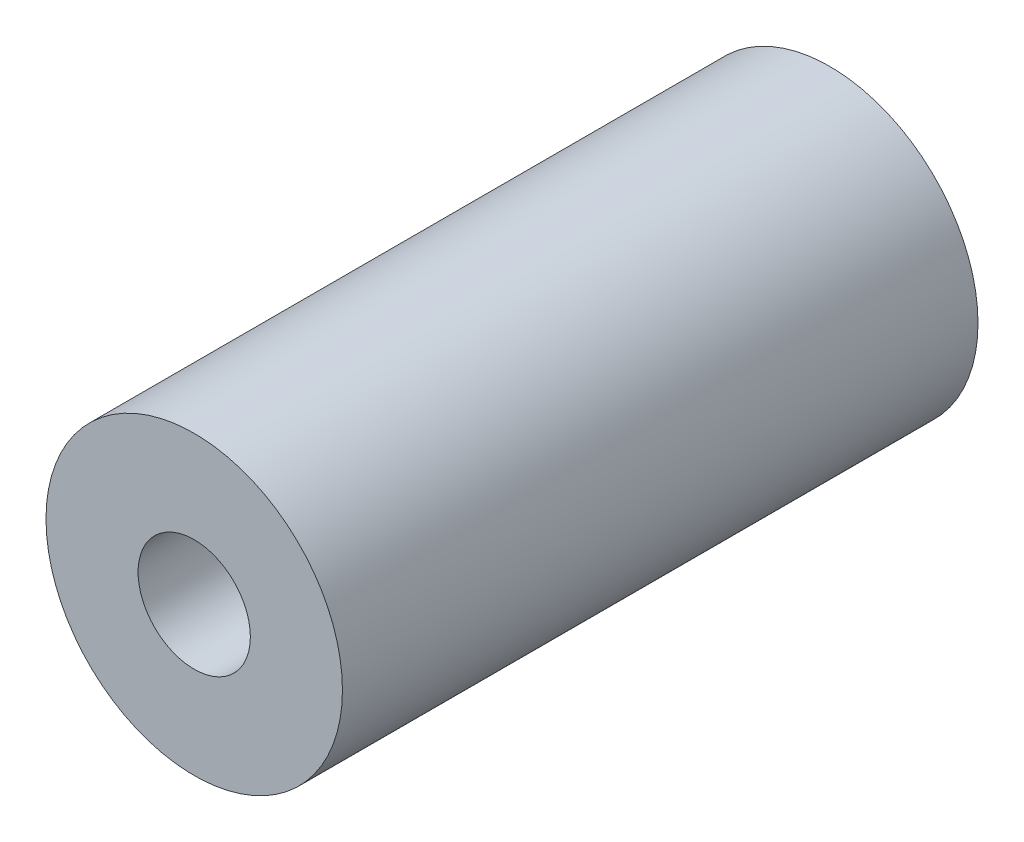
ISO-10303-21;
HEADER;
FILE_DESCRIPTION(('STEP AP214'),'2;1');
FILE_NAME('part.step','',(''),(''),'','','');
FILE_SCHEMA(('AUTOMOTIVE_DESIGN { 1 0 10303 214 1 1 1 1 }'));
ENDSEC;
DATA;
#1=APPLICATION_CONTEXT('core data for automotive mechanical design processes');
#2=APPLICATION_PROTOCOL_DEFINITION('international standard','automotive_design',2000,#1);
#3=PRODUCT_CONTEXT('',#1,'mechanical');
#4=PRODUCT('Part','Part','',(#3));
#5=PRODUCT_RELATED_PRODUCT_CATEGORY('part','',(#4));
#6=PRODUCT_DEFINITION_FORMATION('','',#4);
#7=PRODUCT_DEFINITION_CONTEXT('part definition',#1,'design');
#8=PRODUCT_DEFINITION('design','',#6,#7);
#9=PRODUCT_DEFINITION_SHAPE('','',#8);
#10=(LENGTH_UNIT() NAMED_UNIT(*) SI_UNIT(.MILLI.,.METRE.));
#11=(NAMED_UNIT(*) PLANE_ANGLE_UNIT() SI_UNIT($,.RADIAN.));
#12=(NAMED_UNIT(*) SI_UNIT($,.STERADIAN.) SOLID_ANGLE_UNIT());
#13=UNCERTAINTY_MEASURE_WITH_UNIT(LENGTH_MEASURE(1.E-05),#10,'distance_accuracy_value','');
#14=(GEOMETRIC_REPRESENTATION_CONTEXT(3) GLOBAL_UNCERTAINTY_ASSIGNED_CONTEXT((#13)) GLOBAL_UNIT_ASSIGNED_CONTEXT((#10,
#11,#12)) REPRESENTATION_CONTEXT('',''));
#15=CARTESIAN_POINT('',(0.,0.,0.));
#16=DIRECTION('',(0.,0.,1.));
#17=DIRECTION('',(1.,0.,0.));
#18=AXIS2_PLACEMENT_3D('',#15,#16,#17);
#19=CARTESIAN_POINT('',(0.,0.,-28.3));
#20=DIRECTION('',(0.,0.,1.));
#21=DIRECTION('',(1.,0.,0.));
#22=AXIS2_PLACEMENT_3D('',#19,#20,#21);
#23=CYLINDRICAL_SURFACE('',#22,6.6);
#24=CARTESIAN_POINT('',(0.,0.,-28.3));
#25=DIRECTION('',(0.,0.,1.));
#26=DIRECTION('',(1.,0.,0.));
#27=AXIS2_PLACEMENT_3D('',#24,#25,#26);
#28=CIRCLE('',#27,6.6);
#29=CARTESIAN_POINT('',(6.6,0.,-28.3));
#30=VERTEX_POINT('',#29);
#31=EDGE_CURVE('E10',#30,#30,#28,.T.);
#32=ORIENTED_EDGE('',*,*,#31,.T.);
#33=EDGE_LOOP('',(#32));
#34=FACE_BOUND('',#33,.T.);
#35=CARTESIAN_POINT('',(0.,0.,0.));
#36=DIRECTION('',(0.,0.,1.));
#37=DIRECTION('',(1.,0.,0.));
#38=AXIS2_PLACEMENT_3D('',#35,#36,#37);
#39=CIRCLE('',#38,6.6);
#40=CARTESIAN_POINT('',(6.6,0.,0.));
#41=VERTEX_POINT('',#40);
#42=EDGE_CURVE('E42',#41,#41,#39,.T.);
#43=ORIENTED_EDGE('',*,*,#42,.F.);
#44=EDGE_LOOP('',(#43));
#45=FACE_BOUND('',#44,.T.);
#46=ADVANCED_FACE('F39',(#34,#45),#23,.T.);
#47=CARTESIAN_POINT('',(0.,0.,-28.3));
#48=DIRECTION('',(0.,0.,1.));
#49=DIRECTION('',(1.,0.,0.));
#50=AXIS2_PLACEMENT_3D('',#47,#48,#49);
#51=PLANE('',#50);
#52=CARTESIAN_POINT('',(0.,0.,-28.3));
#53=DIRECTION('',(0.,0.,1.));
#54=DIRECTION('',(1.,0.,0.));
#55=AXIS2_PLACEMENT_3D('',#52,#53,#54);
#56=CIRCLE('',#55,2.5);
#57=CARTESIAN_POINT('',(2.5,0.,-28.3));
#58=VERTEX_POINT('',#57);
#59=EDGE_CURVE('E51',#58,#58,#56,.T.);
#60=ORIENTED_EDGE('',*,*,#59,.T.);
#61=EDGE_LOOP('',(#60));
#62=FACE_BOUND('',#61,.T.);
#63=ORIENTED_EDGE('',*,*,#31,.F.);
#64=EDGE_LOOP('',(#63));
#65=FACE_BOUND('',#64,.T.);
#66=ADVANCED_FACE('F61',(#62,#65),#51,.F.);
#67=CARTESIAN_POINT('',(0.,0.,0.));
#68=DIRECTION('',(0.,0.,1.));
#69=DIRECTION('',(1.,0.,0.));
#70=AXIS2_PLACEMENT_3D('',#67,#68,#69);
#71=PLANE('',#70);
#72=CARTESIAN_POINT('',(0.,0.,0.));
#73=DIRECTION('',(0.,0.,1.));
#74=DIRECTION('',(1.,0.,0.));
#75=AXIS2_PLACEMENT_3D('',#72,#73,#74);
#76=CIRCLE('',#75,2.5);
#77=CARTESIAN_POINT('',(2.5,0.,0.));
#78=VERTEX_POINT('',#77);
#79=EDGE_CURVE('E53',#78,#78,#76,.T.);
#80=ORIENTED_EDGE('',*,*,#79,.F.);
#81=EDGE_LOOP('',(#80));
#82=FACE_BOUND('',#81,.T.);
#83=ORIENTED_EDGE('',*,*,#42,.T.);
#84=EDGE_LOOP('',(#83));
#85=FACE_BOUND('',#84,.T.);
#86=ADVANCED_FACE('F67',(#82,#85),#71,.T.);
#87=CARTESIAN_POINT('',(0.,0.,-28.3));
#88=DIRECTION('',(0.,0.,1.));
#89=DIRECTION('',(1.,0.,0.));
#90=AXIS2_PLACEMENT_3D('',#87,#88,#89);
#91=CYLINDRICAL_SURFACE('',#90,2.5);
#92=ORIENTED_EDGE('',*,*,#59,.F.);
#93=EDGE_LOOP('',(#92));
#94=FACE_BOUND('',#93,.T.);
#95=ORIENTED_EDGE('',*,*,#79,.T.);
#96=EDGE_LOOP('',(#95));
#97=FACE_BOUND('',#96,.T.);
#98=ADVANCED_FACE('F64',(#94,#97),#91,.F.);
#99=CLOSED_SHELL('',(#46,#66,#86,#98));
#100=MANIFOLD_SOLID_BREP('B2',#99);
#101=ADVANCED_BREP_SHAPE_REPRESENTATION('',(#18,#100),#14);
#102=SHAPE_DEFINITION_REPRESENTATION(#9,#101);
ENDSEC;
END-ISO-10303-21;
